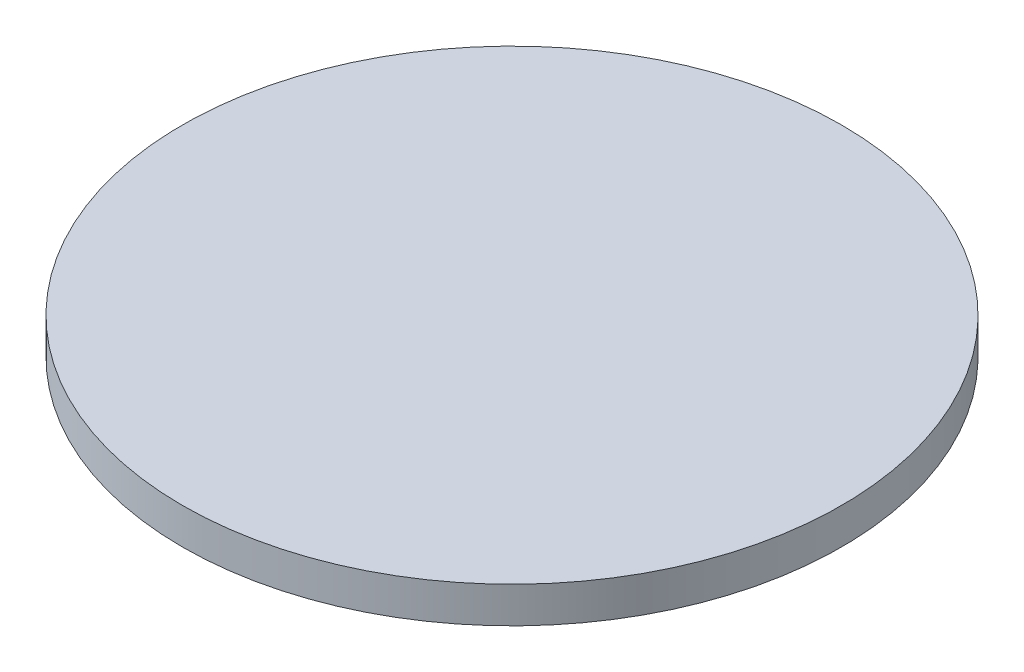
ISO-10303-21;
HEADER;
FILE_DESCRIPTION(('STEP AP214'),'2;1');
FILE_NAME('part.step','',(''),(''),'','','');
FILE_SCHEMA(('AUTOMOTIVE_DESIGN { 1 0 10303 214 1 1 1 1 }'));
ENDSEC;
DATA;
#1=APPLICATION_CONTEXT('core data for automotive mechanical design processes');
#2=APPLICATION_PROTOCOL_DEFINITION('international standard','automotive_design',2000,#1);
#3=PRODUCT_CONTEXT('',#1,'mechanical');
#4=PRODUCT('Part','Part','',(#3));
#5=PRODUCT_RELATED_PRODUCT_CATEGORY('part','',(#4));
#6=PRODUCT_DEFINITION_FORMATION('','',#4);
#7=PRODUCT_DEFINITION_CONTEXT('part definition',#1,'design');
#8=PRODUCT_DEFINITION('design','',#6,#7);
#9=PRODUCT_DEFINITION_SHAPE('','',#8);
#10=(LENGTH_UNIT() NAMED_UNIT(*) SI_UNIT(.MILLI.,.METRE.));
#11=(NAMED_UNIT(*) PLANE_ANGLE_UNIT() SI_UNIT($,.RADIAN.));
#12=(NAMED_UNIT(*) SI_UNIT($,.STERADIAN.) SOLID_ANGLE_UNIT());
#13=UNCERTAINTY_MEASURE_WITH_UNIT(LENGTH_MEASURE(1.E-05),#10,'distance_accuracy_value','');
#14=(GEOMETRIC_REPRESENTATION_CONTEXT(3) GLOBAL_UNCERTAINTY_ASSIGNED_CONTEXT((#13)) GLOBAL_UNIT_ASSIGNED_CONTEXT((#10,
#11,#12)) REPRESENTATION_CONTEXT('',''));
#15=CARTESIAN_POINT('',(0.,0.,0.));
#16=DIRECTION('',(0.,0.,1.));
#17=DIRECTION('',(1.,0.,0.));
#18=AXIS2_PLACEMENT_3D('',#15,#16,#17);
#19=CARTESIAN_POINT('',(0.,7.,0.));
#20=DIRECTION('',(0.,-1.,0.));
#21=DIRECTION('',(0.,0.,-1.));
#22=AXIS2_PLACEMENT_3D('',#19,#20,#21);
#23=CYLINDRICAL_SURFACE('',#22,64.);
#24=CARTESIAN_POINT('',(0.,7.,0.));
#25=DIRECTION('',(0.,1.,0.));
#26=DIRECTION('',(0.,0.,1.));
#27=AXIS2_PLACEMENT_3D('',#24,#25,#26);
#28=CIRCLE('',#27,64.);
#29=CARTESIAN_POINT('',(0.,7.,64.));
#30=VERTEX_POINT('',#29);
#31=EDGE_CURVE('E10',#30,#30,#28,.T.);
#32=ORIENTED_EDGE('',*,*,#31,.F.);
#33=EDGE_LOOP('',(#32));
#34=FACE_BOUND('',#33,.T.);
#35=CARTESIAN_POINT('',(0.,0.,0.));
#36=DIRECTION('',(0.,1.,0.));
#37=DIRECTION('',(0.,0.,1.));
#38=AXIS2_PLACEMENT_3D('',#35,#36,#37);
#39=CIRCLE('',#38,64.);
#40=CARTESIAN_POINT('',(0.,0.,64.));
#41=VERTEX_POINT('',#40);
#42=EDGE_CURVE('E34',#41,#41,#39,.T.);
#43=ORIENTED_EDGE('',*,*,#42,.T.);
#44=EDGE_LOOP('',(#43));
#45=FACE_BOUND('',#44,.T.);
#46=ADVANCED_FACE('F31',(#34,#45),#23,.T.);
#47=CARTESIAN_POINT('',(0.,7.,0.));
#48=DIRECTION('',(0.,1.,0.));
#49=DIRECTION('',(0.,0.,1.));
#50=AXIS2_PLACEMENT_3D('',#47,#48,#49);
#51=PLANE('',#50);
#52=ORIENTED_EDGE('',*,*,#31,.T.);
#53=EDGE_LOOP('',(#52));
#54=FACE_BOUND('',#53,.T.);
#55=ADVANCED_FACE('F46',(#54),#51,.T.);
#56=CARTESIAN_POINT('',(0.,0.,0.));
#57=DIRECTION('',(0.,1.,0.));
#58=DIRECTION('',(0.,0.,1.));
#59=AXIS2_PLACEMENT_3D('',#56,#57,#58);
#60=PLANE('',#59);
#61=ORIENTED_EDGE('',*,*,#42,.F.);
#62=EDGE_LOOP('',(#61));
#63=FACE_BOUND('',#62,.T.);
#64=ADVANCED_FACE('F44',(#63),#60,.F.);
#65=CLOSED_SHELL('',(#46,#55,#64));
#66=MANIFOLD_SOLID_BREP('B2',#65);
#67=ADVANCED_BREP_SHAPE_REPRESENTATION('',(#18,#66),#14);
#68=SHAPE_DEFINITION_REPRESENTATION(#9,#67);
ENDSEC;
END-ISO-10303-21;
